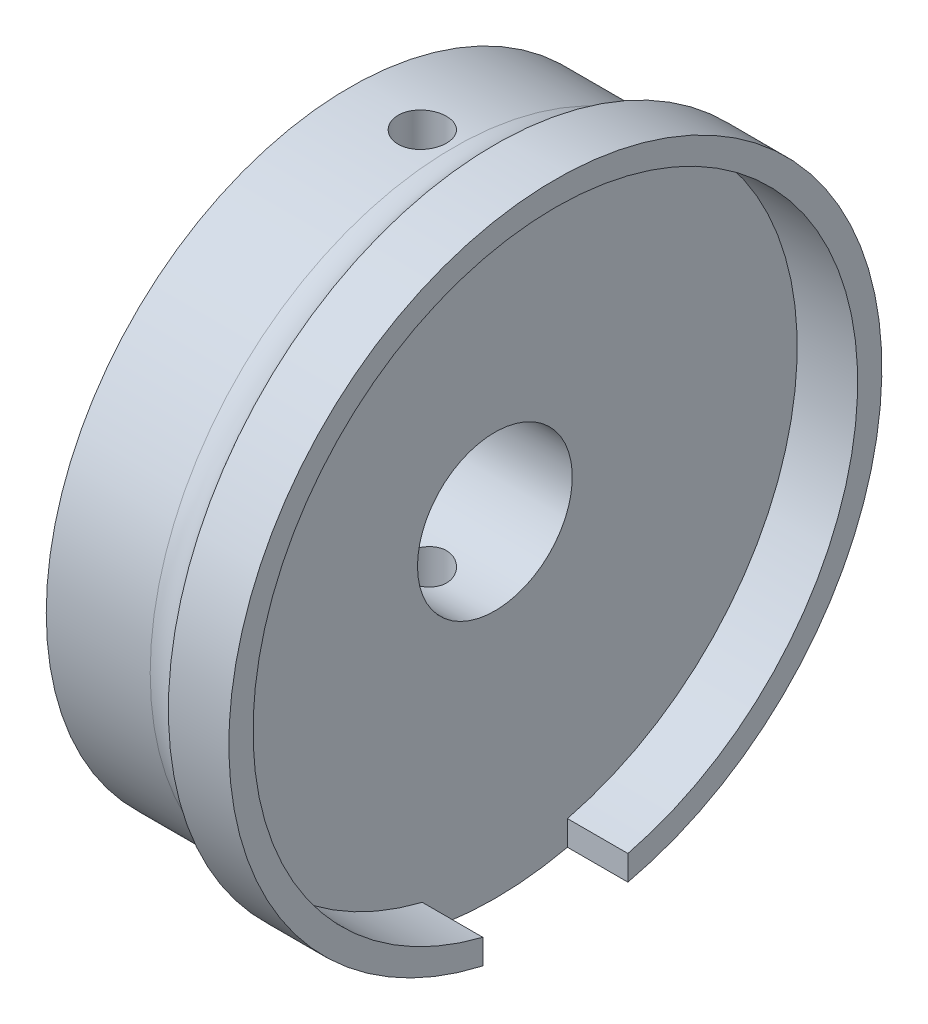
ISO-10303-21;
HEADER;
FILE_DESCRIPTION(('STEP AP214'),'2;1');
FILE_NAME('part.step','',(''),(''),'','','');
FILE_SCHEMA(('AUTOMOTIVE_DESIGN { 1 0 10303 214 1 1 1 1 }'));
ENDSEC;
DATA;
#1=APPLICATION_CONTEXT('core data for automotive mechanical design processes');
#2=APPLICATION_PROTOCOL_DEFINITION('international standard','automotive_design',2000,#1);
#3=PRODUCT_CONTEXT('',#1,'mechanical');
#4=PRODUCT('Part','Part','',(#3));
#5=PRODUCT_RELATED_PRODUCT_CATEGORY('part','',(#4));
#6=PRODUCT_DEFINITION_FORMATION('','',#4);
#7=PRODUCT_DEFINITION_CONTEXT('part definition',#1,'design');
#8=PRODUCT_DEFINITION('design','',#6,#7);
#9=PRODUCT_DEFINITION_SHAPE('','',#8);
#10=(LENGTH_UNIT() NAMED_UNIT(*) SI_UNIT(.MILLI.,.METRE.));
#11=(NAMED_UNIT(*) PLANE_ANGLE_UNIT() SI_UNIT($,.RADIAN.));
#12=(NAMED_UNIT(*) SI_UNIT($,.STERADIAN.) SOLID_ANGLE_UNIT());
#13=UNCERTAINTY_MEASURE_WITH_UNIT(LENGTH_MEASURE(1.E-05),#10,'distance_accuracy_value','');
#14=(GEOMETRIC_REPRESENTATION_CONTEXT(3) GLOBAL_UNCERTAINTY_ASSIGNED_CONTEXT((#13)) GLOBAL_UNIT_ASSIGNED_CONTEXT((#10,
#11,#12)) REPRESENTATION_CONTEXT('',''));
#15=CARTESIAN_POINT('',(0.,0.,0.));
#16=DIRECTION('',(0.,0.,1.));
#17=DIRECTION('',(1.,0.,0.));
#18=AXIS2_PLACEMENT_3D('',#15,#16,#17);
#19=CARTESIAN_POINT('',(6.,0.,0.));
#20=DIRECTION('',(-1.,0.,0.));
#21=DIRECTION('',(0.,0.,1.));
#22=AXIS2_PLACEMENT_3D('',#19,#20,#21);
#23=CYLINDRICAL_SURFACE('',#22,12.55);
#24=CARTESIAN_POINT('',(4.29779554694508,0.,0.));
#25=DIRECTION('',(1.,0.,0.));
#26=DIRECTION('',(0.,0.,-1.));
#27=AXIS2_PLACEMENT_3D('',#24,#25,#26);
#28=CIRCLE('',#27,12.55);
#29=CARTESIAN_POINT('',(4.29779554694508,0.,-12.55));
#30=VERTEX_POINT('',#29);
#31=EDGE_CURVE('E11',#30,#30,#28,.F.);
#32=ORIENTED_EDGE('',*,*,#31,.T.);
#33=EDGE_LOOP('',(#32));
#34=FACE_BOUND('',#33,.T.);
#35=CARTESIAN_POINT('',(3.,-12.5100959228936,1.));
#36=CARTESIAN_POINT('',(2.94392530500643,-12.5100964526146,0.999997546739263));
#37=CARTESIAN_POINT('',(2.88781222170895,-12.5104770009579,0.995267578739973));
#38=CARTESIAN_POINT('',(2.77713801171182,-12.5119580995085,0.976468119966159));
#39=CARTESIAN_POINT('',(2.72257872681765,-12.5130594698738,0.962387990224174));
#40=CARTESIAN_POINT('',(2.61663110486755,-12.5158566801776,0.92529745917909));
#41=CARTESIAN_POINT('',(2.56524101299843,-12.5175521875971,0.902292052289981));
#42=CARTESIAN_POINT('',(2.46706423308634,-12.5213462134671,0.848012739207154));
#43=CARTESIAN_POINT('',(2.42027655023429,-12.5234446445349,0.816740625271618));
#44=CARTESIAN_POINT('',(2.33250989618294,-12.5278136397397,0.746735746382406));
#45=CARTESIAN_POINT('',(2.29154326933219,-12.5300845544623,0.707987525551142));
#46=CARTESIAN_POINT('',(2.21668760732685,-12.5345394227661,0.624162947427995));
#47=CARTESIAN_POINT('',(2.18279887860581,-12.5367233725788,0.579086316292429));
#48=CARTESIAN_POINT('',(2.12302037670629,-12.5407615169639,0.483811425514187));
#49=CARTESIAN_POINT('',(2.09714121636063,-12.5426152726547,0.433606486854583));
#50=CARTESIAN_POINT('',(2.0541843562471,-12.545780394251,0.329546749074968));
#51=CARTESIAN_POINT('',(2.03710651417467,-12.5470917689259,0.275692008982886));
#52=CARTESIAN_POINT('',(2.01227241520281,-12.5490219255725,0.165983724330662));
#53=CARTESIAN_POINT('',(2.00449627552028,-12.5496421846377,0.110134706930862));
#54=CARTESIAN_POINT('',(1.99842486483701,-12.5501252240788,-0.00207903437516881));
#55=CARTESIAN_POINT('',(2.00012943111132,-12.5499880174557,-0.0584437494134892));
#56=CARTESIAN_POINT('',(2.01295475961754,-12.5489728062233,-0.169954111105816));
#57=CARTESIAN_POINT('',(2.02405414003361,-12.5480964837961,-0.22510223442625));
#58=CARTESIAN_POINT('',(2.05532079203876,-12.5457035602777,-0.332750208832182));
#59=CARTESIAN_POINT('',(2.07548814360931,-12.544186953539,-0.385250036554592));
#60=CARTESIAN_POINT('',(2.12434216635384,-12.540681212723,-0.486179301478755));
#61=CARTESIAN_POINT('',(2.15303843581175,-12.5386915467812,-0.534604073484158));
#62=CARTESIAN_POINT('',(2.21812874178935,-12.5344633477448,-0.625957702846895));
#63=CARTESIAN_POINT('',(2.25452292085044,-12.5322248100424,-0.668886458411425));
#64=CARTESIAN_POINT('',(2.33409650748329,-12.5277431693269,-0.748154439305018));
#65=CARTESIAN_POINT('',(2.3772944903858,-12.5255000709151,-0.784475020541218));
#66=CARTESIAN_POINT('',(2.46918465138687,-12.5212683907724,-0.849351662321607));
#67=CARTESIAN_POINT('',(2.51787683347141,-12.5192798092262,-0.877907717232668));
#68=CARTESIAN_POINT('',(2.61938604918242,-12.5157819109752,-0.926443874440319));
#69=CARTESIAN_POINT('',(2.67220353026282,-12.5142726463502,-0.946423044907074));
#70=CARTESIAN_POINT('',(2.78045796424647,-12.511905236907,-0.977224677627526));
#71=CARTESIAN_POINT('',(2.83589486683707,-12.5110470795881,-0.988047315680286));
#72=CARTESIAN_POINT('',(2.94765145087699,-12.5100810358463,-1.00020513989674));
#73=CARTESIAN_POINT('',(3.00396828865495,-12.5099710946849,-1.00156630920588));
#74=CARTESIAN_POINT('',(3.11602936930684,-12.510508505902,-0.994830585723685));
#75=CARTESIAN_POINT('',(3.17177361705309,-12.5111558518311,-0.986733773480174));
#76=CARTESIAN_POINT('',(3.28103276952536,-12.513133021653,-0.961333571720078));
#77=CARTESIAN_POINT('',(3.33455050354815,-12.5144619489041,-0.944042276737334));
#78=CARTESIAN_POINT('',(3.43792503807422,-12.5176517945726,-0.900756231934743));
#79=CARTESIAN_POINT('',(3.48778178478255,-12.5195127208053,-0.874761354254707));
#80=CARTESIAN_POINT('',(3.58253808468921,-12.5235618627505,-0.814740167453415));
#81=CARTESIAN_POINT('',(3.62742662800371,-12.525750781029,-0.780696524978534));
#82=CARTESIAN_POINT('',(3.71086109692741,-12.5302068745256,-0.705569253844884));
#83=CARTESIAN_POINT('',(3.74940692264158,-12.5324740509754,-0.664485514328466));
#84=CARTESIAN_POINT('',(3.81915029114155,-12.5368373019557,-0.576332072132416));
#85=CARTESIAN_POINT('',(3.85033096528159,-12.5389329766574,-0.529249001172143));
#86=CARTESIAN_POINT('',(3.90434324635684,-12.5427113392584,-0.43050013845374));
#87=CARTESIAN_POINT('',(3.92717493055428,-12.5443940309794,-0.378834389109589));
#88=CARTESIAN_POINT('',(3.96381208061402,-12.5471549822108,-0.272447522197831));
#89=CARTESIAN_POINT('',(3.97762802550909,-12.5482339432313,-0.217730032301262));
#90=CARTESIAN_POINT('',(3.99587577082367,-12.5496687028929,-0.106743026463964));
#91=CARTESIAN_POINT('',(4.00030773213065,-12.5500245139323,-0.0504735371488686));
#92=CARTESIAN_POINT('',(3.99965989608121,-12.549972906646,0.0618537800813963));
#93=CARTESIAN_POINT('',(3.99460640858337,-12.5495675994381,0.117911762587571));
#94=CARTESIAN_POINT('',(3.97518592916983,-12.5480434791887,0.22838023288578));
#95=CARTESIAN_POINT('',(3.96081892374793,-12.5469246651124,0.282790718288538));
#96=CARTESIAN_POINT('',(3.92318579172548,-12.5440991037119,0.38842179058771));
#97=CARTESIAN_POINT('',(3.89992007444345,-12.5423923834302,0.439642524078746));
#98=CARTESIAN_POINT('',(3.84515304072495,-12.5385820828605,0.537455128520954));
#99=CARTESIAN_POINT('',(3.81365187072517,-12.5364785096291,0.584047081757316));
#100=CARTESIAN_POINT('',(3.74320949239227,-12.5321037660722,0.671414075973546));
#101=CARTESIAN_POINT('',(3.70424886480198,-12.5298321680137,0.712173437989586));
#102=CARTESIAN_POINT('',(3.6200275296034,-12.5253810214819,0.786590062760005));
#103=CARTESIAN_POINT('',(3.57476529554233,-12.5232014954786,0.820245599753484));
#104=CARTESIAN_POINT('',(3.47914492174979,-12.5191771204791,0.87954064210122));
#105=CARTESIAN_POINT('',(3.42877801669107,-12.5173328628793,0.905166039214481));
#106=CARTESIAN_POINT('',(3.32447658732519,-12.5141951069137,0.947563707300988));
#107=CARTESIAN_POINT('',(3.27054626113747,-12.5129009733492,0.96434619410386));
#108=CARTESIAN_POINT('',(3.1802461590007,-12.5113440661914,0.984290108521158));
#109=CARTESIAN_POINT('',(3.14445775866029,-12.5108781522326,0.99017352871574));
#110=CARTESIAN_POINT('',(3.07245158102203,-12.5102539098106,0.998029262339193));
#111=CARTESIAN_POINT('',(3.03623380476254,-12.5100955806036,1.00000158522433));
#112=CARTESIAN_POINT('',(3.,-12.5100959228936,1.));
#113=B_SPLINE_CURVE_WITH_KNOTS('',3,(#35,#36,#37,#38,#39,#40,#41,#42,#43,#44,#45,#46,#47,#48,
#49,#50,#51,#52,#53,#54,#55,#56,#57,#58,#59,#60,#61,#62,#63,#64,#65,#66,#67,#68,#69,#70,#71,#72,
#73,#74,#75,#76,#77,#78,#79,#80,#81,#82,#83,#84,#85,#86,#87,#88,#89,#90,#91,#92,#93,#94,#95,#96,
#97,#98,#99,#100,#101,#102,#103,#104,#105,#106,#107,#108,#109,#110,#111,#112),.UNSPECIFIED.,.T.,
.F.,(4,2,2,2,2,2,2,2,2,2,2,2,2,2,2,2,2,2,2,2,2,2,2,2,2,2,2,2,2,2,2,2,2,2,2,2,2,2,4),(0.,
0.168091792669204,0.336375174999905,0.504564524684607,0.6727174400475,0.841221788503965,
1.00973343074828,1.17846740760405,1.34719865619037,1.51556858636902,1.68393562668851,
1.85192050477809,2.01990686456004,2.18808299350947,2.35626223683171,2.52490885658597,
2.69355559869229,2.86222065867616,3.03088248033453,3.19908093818539,3.3672779636037,
3.53525428596162,3.70323307608798,3.87157696471728,4.03992350443549,4.20865195406766,
4.37737884223343,4.54590926744373,4.71443680319305,4.88249758351709,5.05055860755888,
5.21861190214321,5.38666220873245,5.55515610128105,5.7236908797396,5.89252011988367,
6.06115388893741,6.16977008246983,6.27838601338946),.UNSPECIFIED.);
#114=CARTESIAN_POINT('',(3.,-12.5100959228936,1.));
#115=VERTEX_POINT('',#114);
#116=EDGE_CURVE('E120',#115,#115,#113,.T.);
#117=ORIENTED_EDGE('',*,*,#116,.F.);
#118=EDGE_LOOP('',(#117));
#119=FACE_BOUND('',#118,.T.);
#120=CARTESIAN_POINT('',(0.,0.,0.));
#121=DIRECTION('',(1.,0.,0.));
#122=DIRECTION('',(0.,0.,-1.));
#123=AXIS2_PLACEMENT_3D('',#120,#121,#122);
#124=CIRCLE('',#123,12.55);
#125=CARTESIAN_POINT('',(0.,0.,-12.55));
#126=VERTEX_POINT('',#125);
#127=EDGE_CURVE('E44',#126,#126,#124,.T.);
#128=ORIENTED_EDGE('',*,*,#127,.T.);
#129=EDGE_LOOP('',(#128));
#130=FACE_BOUND('',#129,.T.);
#131=CARTESIAN_POINT('',(3.,12.5100959228936,-1.));
#132=CARTESIAN_POINT('',(3.05607469499357,12.5100964526146,-0.999997546739263));
#133=CARTESIAN_POINT('',(3.11218777829105,12.5104770009579,-0.995267578739973));
#134=CARTESIAN_POINT('',(3.22286198828818,12.5119580995085,-0.976468119966159));
#135=CARTESIAN_POINT('',(3.27742127318235,12.5130594698738,-0.962387990224174));
#136=CARTESIAN_POINT('',(3.38336889513245,12.5158566801776,-0.92529745917909));
#137=CARTESIAN_POINT('',(3.43475898700157,12.5175521875971,-0.902292052289981));
#138=CARTESIAN_POINT('',(3.53293576691366,12.5213462134671,-0.848012739207154));
#139=CARTESIAN_POINT('',(3.57972344976571,12.5234446445349,-0.816740625271618));
#140=CARTESIAN_POINT('',(3.66749010381706,12.5278136397397,-0.746735746382406));
#141=CARTESIAN_POINT('',(3.70845673066781,12.5300845544623,-0.707987525551142));
#142=CARTESIAN_POINT('',(3.78331239267315,12.5345394227661,-0.624162947427995));
#143=CARTESIAN_POINT('',(3.81720112139419,12.5367233725788,-0.579086316292429));
#144=CARTESIAN_POINT('',(3.87697962329371,12.5407615169639,-0.483811425514186));
#145=CARTESIAN_POINT('',(3.90285878363937,12.5426152726547,-0.433606486854583));
#146=CARTESIAN_POINT('',(3.9458156437529,12.545780394251,-0.329546749074967));
#147=CARTESIAN_POINT('',(3.96289348582533,12.5470917689259,-0.275692008982885));
#148=CARTESIAN_POINT('',(3.98772758479719,12.5490219255725,-0.165983724330662));
#149=CARTESIAN_POINT('',(3.99550372447972,12.5496421846377,-0.110134706930861));
#150=CARTESIAN_POINT('',(4.00157513516299,12.5501252240788,0.002079034375169));
#151=CARTESIAN_POINT('',(3.99987056888868,12.5499880174557,0.0584437494134894));
#152=CARTESIAN_POINT('',(3.98704524038246,12.5489728062233,0.169954111105817));
#153=CARTESIAN_POINT('',(3.97594585996639,12.5480964837961,0.22510223442625));
#154=CARTESIAN_POINT('',(3.94467920796125,12.5457035602777,0.332750208832182));
#155=CARTESIAN_POINT('',(3.92451185639069,12.544186953539,0.385250036554592));
#156=CARTESIAN_POINT('',(3.87565783364616,12.540681212723,0.486179301478755));
#157=CARTESIAN_POINT('',(3.84696156418825,12.5386915467812,0.534604073484158));
#158=CARTESIAN_POINT('',(3.78187125821065,12.5344633477448,0.625957702846895));
#159=CARTESIAN_POINT('',(3.74547707914956,12.5322248100424,0.668886458411425));
#160=CARTESIAN_POINT('',(3.66590349251671,12.5277431693269,0.748154439305018));
#161=CARTESIAN_POINT('',(3.6227055096142,12.5255000709151,0.784475020541218));
#162=CARTESIAN_POINT('',(3.53081534861313,12.5212683907724,0.849351662321607));
#163=CARTESIAN_POINT('',(3.48212316652859,12.5192798092262,0.877907717232668));
#164=CARTESIAN_POINT('',(3.38061395081758,12.5157819109752,0.926443874440319));
#165=CARTESIAN_POINT('',(3.32779646973718,12.5142726463502,0.946423044907074));
#166=CARTESIAN_POINT('',(3.21954203575353,12.511905236907,0.977224677627526));
#167=CARTESIAN_POINT('',(3.16410513316293,12.5110470795881,0.988047315680286));
#168=CARTESIAN_POINT('',(3.05234854912301,12.5100810358463,1.00020513989674));
#169=CARTESIAN_POINT('',(2.99603171134505,12.5099710946849,1.00156630920588));
#170=CARTESIAN_POINT('',(2.88397063069316,12.510508505902,0.994830585723685));
#171=CARTESIAN_POINT('',(2.82822638294691,12.5111558518311,0.986733773480174));
#172=CARTESIAN_POINT('',(2.71896723047464,12.513133021653,0.961333571720078));
#173=CARTESIAN_POINT('',(2.66544949645185,12.5144619489041,0.944042276737334));
#174=CARTESIAN_POINT('',(2.56207496192578,12.5176517945726,0.900756231934743));
#175=CARTESIAN_POINT('',(2.51221821521745,12.5195127208053,0.874761354254707));
#176=CARTESIAN_POINT('',(2.41746191531079,12.5235618627505,0.814740167453415));
#177=CARTESIAN_POINT('',(2.37257337199629,12.525750781029,0.780696524978534));
#178=CARTESIAN_POINT('',(2.28913890307259,12.5302068745256,0.705569253844884));
#179=CARTESIAN_POINT('',(2.25059307735842,12.5324740509754,0.664485514328466));
#180=CARTESIAN_POINT('',(2.18084970885845,12.5368373019557,0.576332072132416));
#181=CARTESIAN_POINT('',(2.14966903471841,12.5389329766574,0.529249001172144));
#182=CARTESIAN_POINT('',(2.09565675364316,12.5427113392584,0.430500138453741));
#183=CARTESIAN_POINT('',(2.07282506944572,12.5443940309794,0.378834389109589));
#184=CARTESIAN_POINT('',(2.03618791938598,12.5471549822108,0.272447522197831));
#185=CARTESIAN_POINT('',(2.02237197449091,12.5482339432313,0.217730032301262));
#186=CARTESIAN_POINT('',(2.00412422917633,12.5496687028929,0.106743026463964));
#187=CARTESIAN_POINT('',(1.99969226786936,12.5500245139323,0.0504735371488685));
#188=CARTESIAN_POINT('',(2.00034010391879,12.549972906646,-0.0618537800813961));
#189=CARTESIAN_POINT('',(2.00539359141663,12.5495675994381,-0.117911762587571));
#190=CARTESIAN_POINT('',(2.02481407083017,12.5480434791887,-0.22838023288578));
#191=CARTESIAN_POINT('',(2.03918107625207,12.5469246651124,-0.282790718288537));
#192=CARTESIAN_POINT('',(2.07681420827452,12.5440991037119,-0.38842179058771));
#193=CARTESIAN_POINT('',(2.10007992555655,12.5423923834302,-0.439642524078746));
#194=CARTESIAN_POINT('',(2.15484695927505,12.5385820828605,-0.537455128520954));
#195=CARTESIAN_POINT('',(2.18634812927483,12.5364785096291,-0.584047081757316));
#196=CARTESIAN_POINT('',(2.25679050760773,12.5321037660722,-0.671414075973546));
#197=CARTESIAN_POINT('',(2.29575113519802,12.5298321680137,-0.712173437989586));
#198=CARTESIAN_POINT('',(2.37997247039661,12.5253810214819,-0.786590062760005));
#199=CARTESIAN_POINT('',(2.42523470445767,12.5232014954786,-0.820245599753484));
#200=CARTESIAN_POINT('',(2.52085507825021,12.5191771204791,-0.87954064210122));
#201=CARTESIAN_POINT('',(2.57122198330893,12.5173328628793,-0.905166039214482));
#202=CARTESIAN_POINT('',(2.67552341267481,12.5141951069137,-0.947563707300988));
#203=CARTESIAN_POINT('',(2.72945373886253,12.5129009733492,-0.96434619410386));
#204=CARTESIAN_POINT('',(2.8197538409993,12.5113440661914,-0.984290108521158));
#205=CARTESIAN_POINT('',(2.85554224133971,12.5108781522326,-0.99017352871574));
#206=CARTESIAN_POINT('',(2.92754841897797,12.5102539098106,-0.998029262339193));
#207=CARTESIAN_POINT('',(2.96376619523746,12.5100955806036,-1.00000158522433));
#208=CARTESIAN_POINT('',(3.,12.5100959228936,-1.));
#209=B_SPLINE_CURVE_WITH_KNOTS('',3,(#131,#132,#133,#134,#135,#136,#137,#138,#139,#140,#141,
#142,#143,#144,#145,#146,#147,#148,#149,#150,#151,#152,#153,#154,#155,#156,#157,#158,#159,#160,
#161,#162,#163,#164,#165,#166,#167,#168,#169,#170,#171,#172,#173,#174,#175,#176,#177,#178,#179,
#180,#181,#182,#183,#184,#185,#186,#187,#188,#189,#190,#191,#192,#193,#194,#195,#196,#197,#198,
#199,#200,#201,#202,#203,#204,#205,#206,#207,#208),.UNSPECIFIED.,.T.,.F.,(4,2,2,2,2,2,2,2,2,2,2,
2,2,2,2,2,2,2,2,2,2,2,2,2,2,2,2,2,2,2,2,2,2,2,2,2,2,2,4),(0.,0.168091792669204,
0.336375174999905,0.504564524684607,0.6727174400475,0.841221788503965,1.00973343074828,
1.17846740760405,1.34719865619037,1.51556858636902,1.68393562668851,1.85192050477809,
2.01990686456004,2.18808299350947,2.35626223683171,2.52490885658597,2.69355559869229,
2.86222065867617,3.03088248033453,3.19908093818539,3.3672779636037,3.53525428596162,
3.70323307608798,3.87157696471728,4.03992350443549,4.20865195406766,4.37737884223343,
4.54590926744373,4.71443680319305,4.88249758351709,5.05055860755888,5.21861190214321,
5.38666220873245,5.55515610128105,5.72369087973961,5.89252011988367,6.06115388893741,
6.16977008246983,6.27838601338946),.UNSPECIFIED.);
#210=CARTESIAN_POINT('',(3.,12.5100959228936,-1.));
#211=VERTEX_POINT('',#210);
#212=EDGE_CURVE('E119',#211,#211,#209,.T.);
#213=ORIENTED_EDGE('',*,*,#212,.T.);
#214=EDGE_LOOP('',(#213));
#215=FACE_BOUND('',#214,.T.);
#216=ADVANCED_FACE('F36',(#34,#119,#130,#215),#23,.T.);
#217=CARTESIAN_POINT('',(6.,0.,0.));
#218=DIRECTION('',(-1.,0.,0.));
#219=DIRECTION('',(0.,0.,1.));
#220=AXIS2_PLACEMENT_3D('',#217,#218,#219);
#221=CYLINDRICAL_SURFACE('',#220,3.2);
#222=CARTESIAN_POINT('',(3.,-3.03973683071413,1.));
#223=CARTESIAN_POINT('',(3.05467762887039,-3.0397371679444,0.99999963024345));
#224=CARTESIAN_POINT('',(3.10935901491222,-3.0412282529855,0.995500310344962));
#225=CARTESIAN_POINT('',(3.21711532865582,-3.04700511293903,0.977673403223082));
#226=CARTESIAN_POINT('',(3.27018981817649,-3.05129164307935,0.964343430262027));
#227=CARTESIAN_POINT('',(3.37315592156192,-3.06212751043461,0.929358305784155));
#228=CARTESIAN_POINT('',(3.42305298648892,-3.06867284148665,0.907717885892257));
#229=CARTESIAN_POINT('',(3.51852215668683,-3.0832832498174,0.856775313386413));
#230=CARTESIAN_POINT('',(3.56409349596691,-3.09134859550518,0.82747180724537));
#231=CARTESIAN_POINT('',(3.65118309399602,-3.10840102132993,0.760956856497509));
#232=CARTESIAN_POINT('',(3.69253088754912,-3.11740898707314,0.723527519776231));
#233=CARTESIAN_POINT('',(3.76847681056702,-3.13515396688779,0.642289637164482));
#234=CARTESIAN_POINT('',(3.80307399755579,-3.1438909429824,0.598480202014875));
#235=CARTESIAN_POINT('',(3.86528885040909,-3.16034842711921,0.504500729994665));
#236=CARTESIAN_POINT('',(3.89273096306519,-3.16804147650186,0.454209245216069));
#237=CARTESIAN_POINT('',(3.93870083988441,-3.18130041466453,0.349443386282729));
#238=CARTESIAN_POINT('',(3.95723069931966,-3.18686680335945,0.294969998789643));
#239=CARTESIAN_POINT('',(3.98428090247766,-3.1950974065668,0.185171485572876));
#240=CARTESIAN_POINT('',(3.99309259983028,-3.19784591187312,0.129924572374571));
#241=CARTESIAN_POINT('',(4.00137947715002,-3.20042876700814,0.0186726511876164));
#242=CARTESIAN_POINT('',(4.00085677948706,-3.20026377928052,-0.0373321815784669));
#243=CARTESIAN_POINT('',(3.99068136673124,-3.1970969290603,-0.146459584283788));
#244=CARTESIAN_POINT('',(3.98134449318958,-3.19419320777728,-0.199614907451236));
#245=CARTESIAN_POINT('',(3.9543240079656,-3.18599586048681,-0.303562450678217));
#246=CARTESIAN_POINT('',(3.93663985193076,-3.18070207861698,-0.354354516384957));
#247=CARTESIAN_POINT('',(3.89322384874009,-3.16818767783636,-0.452862482523825));
#248=CARTESIAN_POINT('',(3.86739615314957,-3.16094426893602,-0.500533124498266));
#249=CARTESIAN_POINT('',(3.80850312023636,-3.14529378362813,-0.590962008921623));
#250=CARTESIAN_POINT('',(3.77543595268975,-3.13688641315531,-0.633719004967068));
#251=CARTESIAN_POINT('',(3.70138109215895,-3.11938936587859,-0.714990158763107));
#252=CARTESIAN_POINT('',(3.66012074492698,-3.11028585591808,-0.75325323927535));
#253=CARTESIAN_POINT('',(3.57168391854049,-3.09272492351789,-0.822391794076293));
#254=CARTESIAN_POINT('',(3.52450674354023,-3.08426757725855,-0.853266398202702));
#255=CARTESIAN_POINT('',(3.42486602491189,-3.06888677321224,-0.907043720158153));
#256=CARTESIAN_POINT('',(3.37234927276522,-3.06198152291129,-0.929853445621562));
#257=CARTESIAN_POINT('',(3.26395240648459,-3.05070036263463,-0.966226767588001));
#258=CARTESIAN_POINT('',(3.20807350863485,-3.04632354398012,-0.979793686125952));
#259=CARTESIAN_POINT('',(3.09694403795316,-3.04079650741015,-0.996811881484679));
#260=CARTESIAN_POINT('',(3.04175840302105,-3.03952373212419,-1.00064763482981));
#261=CARTESIAN_POINT('',(2.93152820680351,-3.04000862071333,-0.999173955986524));
#262=CARTESIAN_POINT('',(2.87648362503608,-3.04176581633218,-0.993865936890527));
#263=CARTESIAN_POINT('',(2.76975336267354,-3.0479916596061,-0.974598988104683));
#264=CARTESIAN_POINT('',(2.71801658073943,-3.05238043274495,-0.960894649284177));
#265=CARTESIAN_POINT('',(2.61758256640454,-3.0632902987222,-0.925522989288344));
#266=CARTESIAN_POINT('',(2.56888583126342,-3.06981173931781,-0.90385436936927));
#267=CARTESIAN_POINT('',(2.47436871218222,-3.084484317206,-0.852460085246963));
#268=CARTESIAN_POINT('',(2.42867086752568,-3.0926768279127,-0.822521179908449));
#269=CARTESIAN_POINT('',(2.34280772291057,-3.10968279178779,-0.755685126943858));
#270=CARTESIAN_POINT('',(2.30264386485976,-3.11849640588703,-0.718786171752629));
#271=CARTESIAN_POINT('',(2.22727170726972,-3.13619350049997,-0.637258358202881));
#272=CARTESIAN_POINT('',(2.1923377710881,-3.14506473828504,-0.592372519830816));
#273=CARTESIAN_POINT('',(2.130487165343,-3.16151247874982,-0.497161236521119));
#274=CARTESIAN_POINT('',(2.10357012855117,-3.16908904072767,-0.446836040886898));
#275=CARTESIAN_POINT('',(2.05877555002265,-3.18205049542799,-0.342484418665465));
#276=CARTESIAN_POINT('',(2.04083256972505,-3.18745119648957,-0.288488147427004));
#277=CARTESIAN_POINT('',(2.01434196912824,-3.19552194118864,-0.178045803245111));
#278=CARTESIAN_POINT('',(2.0057914087332,-3.19819283931423,-0.121600502672285));
#279=CARTESIAN_POINT('',(1.9985671986003,-3.20044642723569,-0.0103879493191192));
#280=CARTESIAN_POINT('',(1.99949723986339,-3.20015303525912,0.0443513535572176));
#281=CARTESIAN_POINT('',(2.01024944883896,-3.19680782464839,0.152858577538598));
#282=CARTESIAN_POINT('',(2.02007103679356,-3.19375618586094,0.206626561743654));
#283=CARTESIAN_POINT('',(2.04807520737782,-3.18527656675837,0.311004094784633));
#284=CARTESIAN_POINT('',(2.0661516862763,-3.17987878368167,0.361644734759585));
#285=CARTESIAN_POINT('',(2.11005666176678,-3.16726356470358,0.459198740400073));
#286=CARTESIAN_POINT('',(2.13588648797875,-3.16004581673077,0.506111465019584));
#287=CARTESIAN_POINT('',(2.19557820667555,-3.1442391750671,0.596609355975752));
#288=CARTESIAN_POINT('',(2.22968281797116,-3.13561207800806,0.640027685642493));
#289=CARTESIAN_POINT('',(2.30452791155478,-3.11806989237613,0.720656633119451));
#290=CARTESIAN_POINT('',(2.34527037931156,-3.10915471827727,0.757865386803311));
#291=CARTESIAN_POINT('',(2.43385257587283,-3.09169514062089,0.826262927290038));
#292=CARTESIAN_POINT('',(2.48188272249307,-3.08317280691291,0.857211423957753));
#293=CARTESIAN_POINT('',(2.5827184962155,-3.06784100223099,0.910563765988107));
#294=CARTESIAN_POINT('',(2.63552218116091,-3.06103083887145,0.932971067228124));
#295=CARTESIAN_POINT('',(2.73977809385109,-3.05045248354059,0.96696944348656));
#296=CARTESIAN_POINT('',(2.79096203795892,-3.04647452041439,0.979319518703782));
#297=CARTESIAN_POINT('',(2.89476306567952,-3.04111685179481,0.995833966528002));
#298=CARTESIAN_POINT('',(2.94737979296986,-3.03973650617324,1.00000035584327));
#299=CARTESIAN_POINT('',(3.,-3.03973683071413,1.));
#300=B_SPLINE_CURVE_WITH_KNOTS('',3,(#222,#223,#224,#225,#226,#227,#228,#229,#230,#231,#232,
#233,#234,#235,#236,#237,#238,#239,#240,#241,#242,#243,#244,#245,#246,#247,#248,#249,#250,#251,
#252,#253,#254,#255,#256,#257,#258,#259,#260,#261,#262,#263,#264,#265,#266,#267,#268,#269,#270,
#271,#272,#273,#274,#275,#276,#277,#278,#279,#280,#281,#282,#283,#284,#285,#286,#287,#288,#289,
#290,#291,#292,#293,#294,#295,#296,#297,#298,#299),.UNSPECIFIED.,.T.,.F.,(4,2,2,2,2,2,2,2,2,2,2,
2,2,2,2,2,2,2,2,2,2,2,2,2,2,2,2,2,2,2,2,2,2,2,2,2,2,2,4),(0.,0.163838510014586,
0.327721301600959,0.491314915248035,0.654937443893129,0.823656644359877,0.992399383482153,
1.16495857566304,1.33747717929655,1.50466978263744,1.67182437172737,1.83320786371118,
1.99460188147392,2.15797123682044,2.32138194165867,2.49160271145184,2.66184351878338,
2.8339877674288,3.00607011157519,3.17123946622954,3.33638329765181,3.496751776254,
3.65714641792478,3.82214090637598,3.98717830399414,4.15905550239119,4.33092482643579,
4.50152191422708,4.67206558502378,4.8355104194153,4.99894459743755,5.16033477201717,
5.32175263919231,5.48864554474082,5.65558846207662,5.82806236391274,6.00046640632968,
6.15817883487019,6.31585239340933),.UNSPECIFIED.);
#301=CARTESIAN_POINT('',(3.,-3.03973683071413,1.));
#302=VERTEX_POINT('',#301);
#303=EDGE_CURVE('E108',#302,#302,#300,.T.);
#304=ORIENTED_EDGE('',*,*,#303,.F.);
#305=EDGE_LOOP('',(#304));
#306=FACE_BOUND('',#305,.T.);
#307=CARTESIAN_POINT('',(6.,0.,0.));
#308=DIRECTION('',(-1.,0.,0.));
#309=DIRECTION('',(0.,0.,1.));
#310=AXIS2_PLACEMENT_3D('',#307,#308,#309);
#311=CIRCLE('',#310,3.2);
#312=CARTESIAN_POINT('',(6.,0.,3.2));
#313=VERTEX_POINT('',#312);
#314=EDGE_CURVE('E95',#313,#313,#311,.T.);
#315=ORIENTED_EDGE('',*,*,#314,.F.);
#316=EDGE_LOOP('',(#315));
#317=FACE_BOUND('',#316,.T.);
#318=CARTESIAN_POINT('',(0.,0.,0.));
#319=DIRECTION('',(-1.,0.,0.));
#320=DIRECTION('',(0.,0.,1.));
#321=AXIS2_PLACEMENT_3D('',#318,#319,#320);
#322=CIRCLE('',#321,3.2);
#323=CARTESIAN_POINT('',(0.,0.,3.2));
#324=VERTEX_POINT('',#323);
#325=EDGE_CURVE('E184',#324,#324,#322,.T.);
#326=ORIENTED_EDGE('',*,*,#325,.T.);
#327=EDGE_LOOP('',(#326));
#328=FACE_BOUND('',#327,.T.);
#329=CARTESIAN_POINT('',(3.,3.03973683071413,-1.));
#330=CARTESIAN_POINT('',(2.94532237112961,3.0397371679444,-0.99999963024345));
#331=CARTESIAN_POINT('',(2.89064098508778,3.0412282529855,-0.995500310344962));
#332=CARTESIAN_POINT('',(2.78288467134418,3.04700511293903,-0.977673403223082));
#333=CARTESIAN_POINT('',(2.72981018182351,3.05129164307935,-0.964343430262026));
#334=CARTESIAN_POINT('',(2.62684407843808,3.06212751043461,-0.929358305784155));
#335=CARTESIAN_POINT('',(2.57694701351108,3.06867284148665,-0.907717885892257));
#336=CARTESIAN_POINT('',(2.48147784331317,3.0832832498174,-0.856775313386413));
#337=CARTESIAN_POINT('',(2.43590650403309,3.09134859550518,-0.827471807245369));
#338=CARTESIAN_POINT('',(2.34881690600398,3.10840102132993,-0.760956856497509));
#339=CARTESIAN_POINT('',(2.30746911245088,3.11740898707314,-0.723527519776231));
#340=CARTESIAN_POINT('',(2.23152318943298,3.13515396688779,-0.642289637164482));
#341=CARTESIAN_POINT('',(2.19692600244421,3.1438909429824,-0.598480202014875));
#342=CARTESIAN_POINT('',(2.13471114959091,3.16034842711921,-0.504500729994665));
#343=CARTESIAN_POINT('',(2.10726903693481,3.16804147650186,-0.454209245216069));
#344=CARTESIAN_POINT('',(2.06129916011558,3.18130041466453,-0.349443386282729));
#345=CARTESIAN_POINT('',(2.04276930068034,3.18686680335945,-0.294969998789643));
#346=CARTESIAN_POINT('',(2.01571909752234,3.1950974065668,-0.185171485572876));
#347=CARTESIAN_POINT('',(2.00690740016972,3.19784591187312,-0.129924572374572));
#348=CARTESIAN_POINT('',(1.99862052284998,3.20042876700814,-0.0186726511876166));
#349=CARTESIAN_POINT('',(1.99914322051294,3.20026377928052,0.0373321815784667));
#350=CARTESIAN_POINT('',(2.00931863326876,3.1970969290603,0.146459584283788));
#351=CARTESIAN_POINT('',(2.01865550681042,3.19419320777728,0.199614907451235));
#352=CARTESIAN_POINT('',(2.0456759920344,3.18599586048681,0.303562450678216));
#353=CARTESIAN_POINT('',(2.06336014806924,3.18070207861698,0.354354516384956));
#354=CARTESIAN_POINT('',(2.10677615125991,3.16818767783636,0.452862482523825));
#355=CARTESIAN_POINT('',(2.13260384685043,3.16094426893602,0.500533124498265));
#356=CARTESIAN_POINT('',(2.19149687976364,3.14529378362813,0.590962008921623));
#357=CARTESIAN_POINT('',(2.22456404731025,3.13688641315531,0.633719004967068));
#358=CARTESIAN_POINT('',(2.29861890784105,3.11938936587859,0.714990158763107));
#359=CARTESIAN_POINT('',(2.33987925507302,3.11028585591808,0.75325323927535));
#360=CARTESIAN_POINT('',(2.42831608145951,3.09272492351789,0.822391794076293));
#361=CARTESIAN_POINT('',(2.47549325645977,3.08426757725855,0.853266398202702));
#362=CARTESIAN_POINT('',(2.57513397508811,3.06888677321224,0.907043720158153));
#363=CARTESIAN_POINT('',(2.62765072723478,3.06198152291129,0.929853445621562));
#364=CARTESIAN_POINT('',(2.73604759351541,3.05070036263463,0.966226767588001));
#365=CARTESIAN_POINT('',(2.79192649136515,3.04632354398012,0.979793686125952));
#366=CARTESIAN_POINT('',(2.90305596204684,3.04079650741015,0.996811881484679));
#367=CARTESIAN_POINT('',(2.95824159697895,3.03952373212419,1.00064763482981));
#368=CARTESIAN_POINT('',(3.06847179319649,3.04000862071333,0.999173955986524));
#369=CARTESIAN_POINT('',(3.12351637496392,3.04176581633218,0.993865936890527));
#370=CARTESIAN_POINT('',(3.23024663732646,3.0479916596061,0.974598988104683));
#371=CARTESIAN_POINT('',(3.28198341926057,3.05238043274495,0.960894649284177));
#372=CARTESIAN_POINT('',(3.38241743359546,3.0632902987222,0.925522989288344));
#373=CARTESIAN_POINT('',(3.43111416873658,3.06981173931781,0.90385436936927));
#374=CARTESIAN_POINT('',(3.52563128781778,3.084484317206,0.852460085246963));
#375=CARTESIAN_POINT('',(3.57132913247432,3.0926768279127,0.822521179908449));
#376=CARTESIAN_POINT('',(3.65719227708943,3.10968279178779,0.755685126943858));
#377=CARTESIAN_POINT('',(3.69735613514024,3.11849640588703,0.718786171752629));
#378=CARTESIAN_POINT('',(3.77272829273028,3.13619350049997,0.637258358202881));
#379=CARTESIAN_POINT('',(3.8076622289119,3.14506473828504,0.592372519830816));
#380=CARTESIAN_POINT('',(3.869512834657,3.16151247874982,0.497161236521119));
#381=CARTESIAN_POINT('',(3.89642987144883,3.16908904072767,0.446836040886898));
#382=CARTESIAN_POINT('',(3.94122444997735,3.18205049542799,0.342484418665465));
#383=CARTESIAN_POINT('',(3.95916743027495,3.18745119648957,0.288488147427004));
#384=CARTESIAN_POINT('',(3.98565803087177,3.19552194118864,0.178045803245112));
#385=CARTESIAN_POINT('',(3.9942085912668,3.19819283931423,0.121600502672285));
#386=CARTESIAN_POINT('',(4.0014328013997,3.20044642723569,0.0103879493191189));
#387=CARTESIAN_POINT('',(4.00050276013661,3.20015303525912,-0.0443513535572179));
#388=CARTESIAN_POINT('',(3.98975055116104,3.19680782464839,-0.152858577538598));
#389=CARTESIAN_POINT('',(3.97992896320644,3.19375618586094,-0.206626561743655));
#390=CARTESIAN_POINT('',(3.95192479262218,3.18527656675837,-0.311004094784633));
#391=CARTESIAN_POINT('',(3.9338483137237,3.17987878368167,-0.361644734759584));
#392=CARTESIAN_POINT('',(3.88994333823322,3.16726356470358,-0.459198740400072));
#393=CARTESIAN_POINT('',(3.86411351202125,3.16004581673077,-0.506111465019584));
#394=CARTESIAN_POINT('',(3.80442179332445,3.1442391750671,-0.596609355975752));
#395=CARTESIAN_POINT('',(3.77031718202884,3.13561207800806,-0.640027685642493));
#396=CARTESIAN_POINT('',(3.69547208844522,3.11806989237613,-0.72065663311945));
#397=CARTESIAN_POINT('',(3.65472962068844,3.10915471827727,-0.757865386803311));
#398=CARTESIAN_POINT('',(3.56614742412717,3.09169514062089,-0.826262927290038));
#399=CARTESIAN_POINT('',(3.51811727750693,3.08317280691291,-0.857211423957753));
#400=CARTESIAN_POINT('',(3.4172815037845,3.06784100223099,-0.910563765988108));
#401=CARTESIAN_POINT('',(3.36447781883909,3.06103083887145,-0.932971067228124));
#402=CARTESIAN_POINT('',(3.26022190614891,3.05045248354059,-0.96696944348656));
#403=CARTESIAN_POINT('',(3.20903796204108,3.04647452041439,-0.979319518703781));
#404=CARTESIAN_POINT('',(3.10523693432048,3.0411168517948,-0.995833966528002));
#405=CARTESIAN_POINT('',(3.05262020703014,3.03973650617324,-1.00000035584327));
#406=CARTESIAN_POINT('',(3.,3.03973683071413,-1.));
#407=B_SPLINE_CURVE_WITH_KNOTS('',3,(#329,#330,#331,#332,#333,#334,#335,#336,#337,#338,#339,
#340,#341,#342,#343,#344,#345,#346,#347,#348,#349,#350,#351,#352,#353,#354,#355,#356,#357,#358,
#359,#360,#361,#362,#363,#364,#365,#366,#367,#368,#369,#370,#371,#372,#373,#374,#375,#376,#377,
#378,#379,#380,#381,#382,#383,#384,#385,#386,#387,#388,#389,#390,#391,#392,#393,#394,#395,#396,
#397,#398,#399,#400,#401,#402,#403,#404,#405,#406),.UNSPECIFIED.,.T.,.F.,(4,2,2,2,2,2,2,2,2,2,2,
2,2,2,2,2,2,2,2,2,2,2,2,2,2,2,2,2,2,2,2,2,2,2,2,2,2,2,4),(0.,0.163838510014587,
0.327721301600959,0.491314915248036,0.654937443893129,0.823656644359877,0.992399383482153,
1.16495857566304,1.33747717929655,1.50466978263744,1.67182437172737,1.83320786371117,
1.99460188147392,2.15797123682044,2.32138194165867,2.49160271145184,2.66184351878338,
2.8339877674288,3.00607011157519,3.17123946622954,3.33638329765181,3.496751776254,
3.65714641792478,3.82214090637598,3.98717830399414,4.15905550239119,4.33092482643579,
4.50152191422708,4.67206558502378,4.8355104194153,4.99894459743755,5.16033477201717,
5.32175263919231,5.48864554474082,5.65558846207662,5.82806236391273,6.00046640632967,
6.15817883487019,6.31585239340933),.UNSPECIFIED.);
#408=CARTESIAN_POINT('',(3.,3.03973683071413,-1.));
#409=VERTEX_POINT('',#408);
#410=EDGE_CURVE('E111',#409,#409,#407,.T.);
#411=ORIENTED_EDGE('',*,*,#410,.T.);
#412=EDGE_LOOP('',(#411));
#413=FACE_BOUND('',#412,.T.);
#414=ADVANCED_FACE('F154',(#306,#317,#328,#413),#221,.F.);
#415=CARTESIAN_POINT('',(0.,0.,0.));
#416=DIRECTION('',(1.,0.,0.));
#417=DIRECTION('',(0.,0.,-1.));
#418=AXIS2_PLACEMENT_3D('',#415,#416,#417);
#419=PLANE('',#418);
#420=ORIENTED_EDGE('',*,*,#325,.F.);
#421=EDGE_LOOP('',(#420));
#422=FACE_BOUND('',#421,.T.);
#423=ORIENTED_EDGE('',*,*,#127,.F.);
#424=EDGE_LOOP('',(#423));
#425=FACE_BOUND('',#424,.T.);
#426=ADVANCED_FACE('F160',(#422,#425),#419,.F.);
#427=CARTESIAN_POINT('',(3.,-12.551,0.));
#428=DIRECTION('',(0.,1.,0.));
#429=DIRECTION('',(0.,0.,1.));
#430=AXIS2_PLACEMENT_3D('',#427,#428,#429);
#431=CYLINDRICAL_SURFACE('',#430,1.);
#432=ORIENTED_EDGE('',*,*,#303,.T.);
#433=EDGE_LOOP('',(#432));
#434=FACE_BOUND('',#433,.T.);
#435=ORIENTED_EDGE('',*,*,#116,.T.);
#436=EDGE_LOOP('',(#435));
#437=FACE_BOUND('',#436,.T.);
#438=ADVANCED_FACE('F166',(#434,#437),#431,.F.);
#439=CARTESIAN_POINT('',(3.,12.551,0.));
#440=DIRECTION('',(0.,-1.,0.));
#441=DIRECTION('',(0.,0.,-1.));
#442=AXIS2_PLACEMENT_3D('',#439,#440,#441);
#443=CYLINDRICAL_SURFACE('',#442,1.);
#444=ORIENTED_EDGE('',*,*,#410,.F.);
#445=EDGE_LOOP('',(#444));
#446=FACE_BOUND('',#445,.T.);
#447=ORIENTED_EDGE('',*,*,#212,.F.);
#448=EDGE_LOOP('',(#447));
#449=FACE_BOUND('',#448,.T.);
#450=ADVANCED_FACE('F126',(#446,#449),#443,.F.);
#451=CARTESIAN_POINT('',(8.5,0.,0.));
#452=DIRECTION('',(1.,0.,0.));
#453=DIRECTION('',(0.,0.,-1.));
#454=AXIS2_PLACEMENT_3D('',#451,#452,#453);
#455=PLANE('',#454);
#456=DIRECTION('',(0.,1.,0.));
#457=VECTOR('',#456,1.);
#458=CARTESIAN_POINT('',(8.5,-15.,-3.));
#459=LINE('',#458,#457);
#460=CARTESIAN_POINT('',(8.5,-13.1624465810882,-3.));
#461=VERTEX_POINT('',#460);
#462=CARTESIAN_POINT('',(8.5,-12.1346610995116,-3.));
#463=VERTEX_POINT('',#462);
#464=EDGE_CURVE('E283',#461,#463,#459,.T.);
#465=ORIENTED_EDGE('',*,*,#464,.F.);
#466=CARTESIAN_POINT('',(8.5,0.,0.));
#467=DIRECTION('',(1.,0.,0.));
#468=DIRECTION('',(0.,0.,-1.));
#469=AXIS2_PLACEMENT_3D('',#466,#467,#468);
#470=CIRCLE('',#469,13.5);
#471=CARTESIAN_POINT('',(8.5,-13.1624465810882,3.));
#472=VERTEX_POINT('',#471);
#473=EDGE_CURVE('E105',#461,#472,#470,.T.);
#474=ORIENTED_EDGE('',*,*,#473,.T.);
#475=DIRECTION('',(0.,1.,0.));
#476=VECTOR('',#475,1.);
#477=CARTESIAN_POINT('',(8.5,-15.,3.));
#478=LINE('',#477,#476);
#479=CARTESIAN_POINT('',(8.5,-12.1346610995116,3.));
#480=VERTEX_POINT('',#479);
#481=EDGE_CURVE('E83',#472,#480,#478,.T.);
#482=ORIENTED_EDGE('',*,*,#481,.T.);
#483=CARTESIAN_POINT('',(8.5,0.,0.));
#484=DIRECTION('',(1.,0.,0.));
#485=DIRECTION('',(0.,0.,-1.));
#486=AXIS2_PLACEMENT_3D('',#483,#484,#485);
#487=CIRCLE('',#486,12.5);
#488=EDGE_CURVE('E91',#463,#480,#487,.T.);
#489=ORIENTED_EDGE('',*,*,#488,.F.);
#490=EDGE_LOOP('',(#465,#474,#482,#489));
#491=FACE_BOUND('',#490,.T.);
#492=ADVANCED_FACE('F135',(#491),#455,.T.);
#493=CARTESIAN_POINT('',(8.5,0.,0.));
#494=DIRECTION('',(-1.,0.,0.));
#495=DIRECTION('',(0.,0.,1.));
#496=AXIS2_PLACEMENT_3D('',#493,#494,#495);
#497=CYLINDRICAL_SURFACE('',#496,13.5);
#498=ORIENTED_EDGE('',*,*,#473,.F.);
#499=DIRECTION('',(-1.,0.,0.));
#500=VECTOR('',#499,1.);
#501=CARTESIAN_POINT('',(8.5,-13.1624465810882,-3.));
#502=LINE('',#501,#500);
#503=CARTESIAN_POINT('',(6.,-13.1624465810882,-3.));
#504=VERTEX_POINT('',#503);
#505=EDGE_CURVE('E100',#461,#504,#502,.T.);
#506=ORIENTED_EDGE('',*,*,#505,.T.);
#507=CARTESIAN_POINT('',(6.,0.,0.));
#508=DIRECTION('',(1.,0.,0.));
#509=DIRECTION('',(0.,0.,-1.));
#510=AXIS2_PLACEMENT_3D('',#507,#508,#509);
#511=CIRCLE('',#510,13.5);
#512=CARTESIAN_POINT('',(6.,-13.1624465810882,3.));
#513=VERTEX_POINT('',#512);
#514=EDGE_CURVE('E98',#504,#513,#511,.T.);
#515=ORIENTED_EDGE('',*,*,#514,.T.);
#516=DIRECTION('',(-1.,0.,0.));
#517=VECTOR('',#516,1.);
#518=CARTESIAN_POINT('',(8.5,-13.1624465810882,3.));
#519=LINE('',#518,#517);
#520=EDGE_CURVE('E81',#513,#472,#519,.F.);
#521=ORIENTED_EDGE('',*,*,#520,.T.);
#522=EDGE_LOOP('',(#498,#506,#515,#521));
#523=FACE_BOUND('',#522,.T.);
#524=ADVANCED_FACE('F131',(#523),#497,.T.);
#525=CARTESIAN_POINT('',(6.,0.,0.));
#526=DIRECTION('',(1.,0.,0.));
#527=DIRECTION('',(0.,0.,-1.));
#528=AXIS2_PLACEMENT_3D('',#525,#526,#527);
#529=PLANE('',#528);
#530=ORIENTED_EDGE('',*,*,#314,.T.);
#531=EDGE_LOOP('',(#530));
#532=FACE_BOUND('',#531,.T.);
#533=DIRECTION('',(0.,1.,0.));
#534=VECTOR('',#533,1.);
#535=CARTESIAN_POINT('',(6.,-15.,-3.));
#536=LINE('',#535,#534);
#537=CARTESIAN_POINT('',(6.,-12.1346610995116,-3.));
#538=VERTEX_POINT('',#537);
#539=EDGE_CURVE('E92',#504,#538,#536,.T.);
#540=ORIENTED_EDGE('',*,*,#539,.T.);
#541=CARTESIAN_POINT('',(6.,0.,0.));
#542=DIRECTION('',(1.,0.,0.));
#543=DIRECTION('',(0.,0.,-1.));
#544=AXIS2_PLACEMENT_3D('',#541,#542,#543);
#545=CIRCLE('',#544,12.5);
#546=CARTESIAN_POINT('',(6.,-12.1346610995116,3.));
#547=VERTEX_POINT('',#546);
#548=EDGE_CURVE('E89',#538,#547,#545,.T.);
#549=ORIENTED_EDGE('',*,*,#548,.T.);
#550=DIRECTION('',(0.,1.,0.));
#551=VECTOR('',#550,1.);
#552=CARTESIAN_POINT('',(6.,-15.,3.));
#553=LINE('',#552,#551);
#554=EDGE_CURVE('E51',#513,#547,#553,.T.);
#555=ORIENTED_EDGE('',*,*,#554,.F.);
#556=EDGE_CURVE('E109',#513,#504,#511,.T.);
#557=ORIENTED_EDGE('',*,*,#556,.T.);
#558=EDGE_LOOP('',(#540,#549,#555,#557));
#559=FACE_BOUND('',#558,.T.);
#560=ADVANCED_FACE('F94',(#532,#559),#529,.T.);
#561=CARTESIAN_POINT('',(6.,0.,0.));
#562=DIRECTION('',(1.,0.,0.));
#563=DIRECTION('',(0.,0.,-1.));
#564=AXIS2_PLACEMENT_3D('',#561,#562,#563);
#565=CYLINDRICAL_SURFACE('',#564,12.5);
#566=ORIENTED_EDGE('',*,*,#548,.F.);
#567=DIRECTION('',(1.,0.,0.));
#568=VECTOR('',#567,1.);
#569=CARTESIAN_POINT('',(6.,-12.1346610995116,-3.));
#570=LINE('',#569,#568);
#571=EDGE_CURVE('E59',#538,#463,#570,.T.);
#572=ORIENTED_EDGE('',*,*,#571,.T.);
#573=ORIENTED_EDGE('',*,*,#488,.T.);
#574=DIRECTION('',(1.,0.,0.));
#575=VECTOR('',#574,1.);
#576=CARTESIAN_POINT('',(6.,-12.1346610995116,3.));
#577=LINE('',#576,#575);
#578=EDGE_CURVE('E78',#480,#547,#577,.F.);
#579=ORIENTED_EDGE('',*,*,#578,.T.);
#580=EDGE_LOOP('',(#566,#572,#573,#579));
#581=FACE_BOUND('',#580,.T.);
#582=ADVANCED_FACE('F88',(#581),#565,.F.);
#583=CARTESIAN_POINT('',(4.29779554694508,0.,0.));
#584=DIRECTION('',(1.,0.,0.));
#585=DIRECTION('',(0.,0.,-1.));
#586=AXIS2_PLACEMENT_3D('',#583,#584,#585);
#587=TOROIDAL_SURFACE('',#586,14.55,2.);
#588=ORIENTED_EDGE('',*,*,#31,.F.);
#589=EDGE_LOOP('',(#588));
#590=FACE_BOUND('',#589,.T.);
#591=ORIENTED_EDGE('',*,*,#556,.F.);
#592=ORIENTED_EDGE('',*,*,#514,.F.);
#593=EDGE_LOOP('',(#591,#592));
#594=FACE_BOUND('',#593,.T.);
#595=ADVANCED_FACE('F38',(#590,#594),#587,.F.);
#596=CARTESIAN_POINT('',(6.,-15.,-3.));
#597=DIRECTION('',(0.,0.,-1.));
#598=DIRECTION('',(-1.,0.,0.));
#599=AXIS2_PLACEMENT_3D('',#596,#597,#598);
#600=PLANE('',#599);
#601=ORIENTED_EDGE('',*,*,#464,.T.);
#602=ORIENTED_EDGE('',*,*,#571,.F.);
#603=ORIENTED_EDGE('',*,*,#539,.F.);
#604=ORIENTED_EDGE('',*,*,#505,.F.);
#605=EDGE_LOOP('',(#601,#602,#603,#604));
#606=FACE_BOUND('',#605,.T.);
#607=ADVANCED_FACE('F147',(#606),#600,.F.);
#608=CARTESIAN_POINT('',(6.,-15.,3.));
#609=DIRECTION('',(0.,0.,1.));
#610=DIRECTION('',(1.,0.,0.));
#611=AXIS2_PLACEMENT_3D('',#608,#609,#610);
#612=PLANE('',#611);
#613=ORIENTED_EDGE('',*,*,#554,.T.);
#614=ORIENTED_EDGE('',*,*,#578,.F.);
#615=ORIENTED_EDGE('',*,*,#481,.F.);
#616=ORIENTED_EDGE('',*,*,#520,.F.);
#617=EDGE_LOOP('',(#613,#614,#615,#616));
#618=FACE_BOUND('',#617,.T.);
#619=ADVANCED_FACE('F77',(#618),#612,.F.);
#620=CLOSED_SHELL('',(#216,#414,#426,#438,#450,#492,#524,#560,#582,#595,#607,#619));
#621=MANIFOLD_SOLID_BREP('B2',#620);
#622=ADVANCED_BREP_SHAPE_REPRESENTATION('',(#18,#621),#14);
#623=SHAPE_DEFINITION_REPRESENTATION(#9,#622);
ENDSEC;
END-ISO-10303-21;
